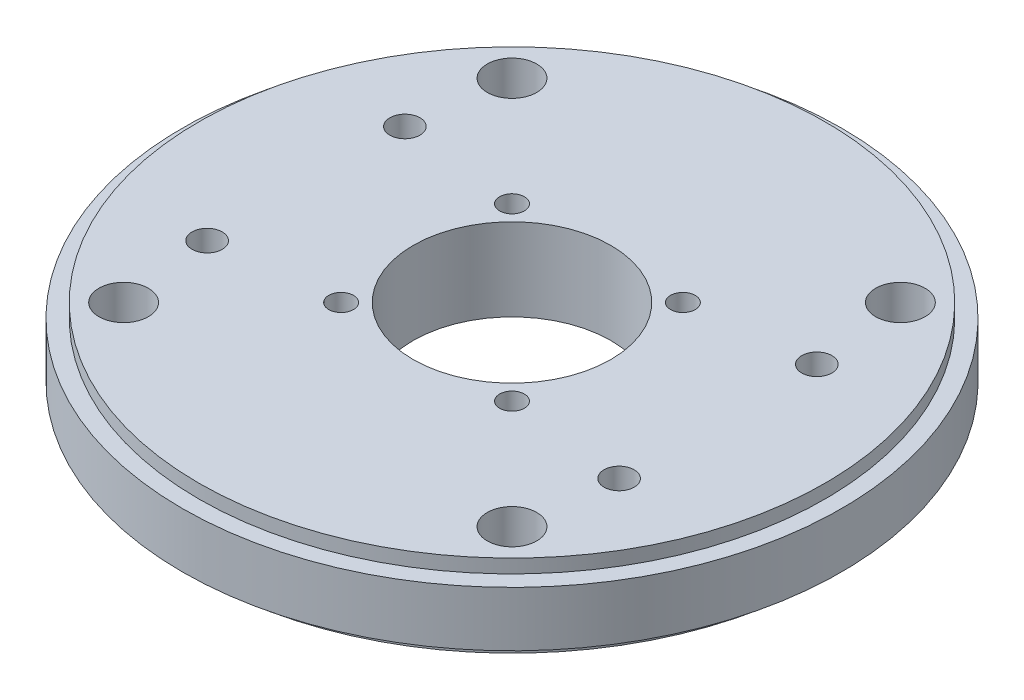
ISO-10303-21;
HEADER;
FILE_DESCRIPTION(('STEP AP214'),'2;1');
FILE_NAME('part.step','',(''),(''),'','','');
FILE_SCHEMA(('AUTOMOTIVE_DESIGN { 1 0 10303 214 1 1 1 1 }'));
ENDSEC;
DATA;
#1=APPLICATION_CONTEXT('core data for automotive mechanical design processes');
#2=APPLICATION_PROTOCOL_DEFINITION('international standard','automotive_design',2000,#1);
#3=PRODUCT_CONTEXT('',#1,'mechanical');
#4=PRODUCT('Part','Part','',(#3));
#5=PRODUCT_RELATED_PRODUCT_CATEGORY('part','',(#4));
#6=PRODUCT_DEFINITION_FORMATION('','',#4);
#7=PRODUCT_DEFINITION_CONTEXT('part definition',#1,'design');
#8=PRODUCT_DEFINITION('design','',#6,#7);
#9=PRODUCT_DEFINITION_SHAPE('','',#8);
#10=(LENGTH_UNIT() NAMED_UNIT(*) SI_UNIT(.MILLI.,.METRE.));
#11=(NAMED_UNIT(*) PLANE_ANGLE_UNIT() SI_UNIT($,.RADIAN.));
#12=(NAMED_UNIT(*) SI_UNIT($,.STERADIAN.) SOLID_ANGLE_UNIT());
#13=UNCERTAINTY_MEASURE_WITH_UNIT(LENGTH_MEASURE(1.E-05),#10,'distance_accuracy_value','');
#14=(GEOMETRIC_REPRESENTATION_CONTEXT(3) GLOBAL_UNCERTAINTY_ASSIGNED_CONTEXT((#13)) GLOBAL_UNIT_ASSIGNED_CONTEXT((#10,
#11,#12)) REPRESENTATION_CONTEXT('',''));
#15=CARTESIAN_POINT('',(0.,0.,0.));
#16=DIRECTION('',(0.,0.,1.));
#17=DIRECTION('',(1.,0.,0.));
#18=AXIS2_PLACEMENT_3D('',#15,#16,#17);
#19=CARTESIAN_POINT('',(0.,-7.5,0.));
#20=DIRECTION('',(0.,1.,0.));
#21=DIRECTION('',(0.,0.,1.));
#22=AXIS2_PLACEMENT_3D('',#19,#20,#21);
#23=PLANE('',#22);
#24=CARTESIAN_POINT('',(-35.355339059328,-7.5,-35.3553390593269));
#25=DIRECTION('',(0.,1.,0.));
#26=DIRECTION('',(0.,0.,1.));
#27=AXIS2_PLACEMENT_3D('',#24,#25,#26);
#28=CIRCLE('',#27,4.49999999999999);
#29=CARTESIAN_POINT('',(-35.355339059328,-7.5,-30.8553390593269));
#30=VERTEX_POINT('',#29);
#31=EDGE_CURVE('E131',#30,#30,#28,.T.);
#32=ORIENTED_EDGE('',*,*,#31,.T.);
#33=EDGE_LOOP('',(#32));
#34=FACE_BOUND('',#33,.T.);
#35=CARTESIAN_POINT('',(35.3553390593272,-7.5,-35.3553390593276));
#36=DIRECTION('',(0.,1.,0.));
#37=DIRECTION('',(0.,0.,1.));
#38=AXIS2_PLACEMENT_3D('',#35,#36,#37);
#39=CIRCLE('',#38,4.49999999999998);
#40=CARTESIAN_POINT('',(35.3553390593272,-7.5,-30.8553390593277));
#41=VERTEX_POINT('',#40);
#42=EDGE_CURVE('E125',#41,#41,#39,.T.);
#43=ORIENTED_EDGE('',*,*,#42,.T.);
#44=EDGE_LOOP('',(#43));
#45=FACE_BOUND('',#44,.T.);
#46=CARTESIAN_POINT('',(35.3553390593278,-7.5,35.3553390593271));
#47=DIRECTION('',(0.,1.,0.));
#48=DIRECTION('',(0.,0.,1.));
#49=AXIS2_PLACEMENT_3D('',#46,#47,#48);
#50=CIRCLE('',#49,4.49999999999998);
#51=CARTESIAN_POINT('',(35.3553390593278,-7.5,39.8553390593271));
#52=VERTEX_POINT('',#51);
#53=EDGE_CURVE('E119',#52,#52,#50,.T.);
#54=ORIENTED_EDGE('',*,*,#53,.T.);
#55=EDGE_LOOP('',(#54));
#56=FACE_BOUND('',#55,.T.);
#57=CARTESIAN_POINT('',(-35.3553390593272,-7.5,35.3553390593276));
#58=DIRECTION('',(0.,1.,0.));
#59=DIRECTION('',(0.,0.,1.));
#60=AXIS2_PLACEMENT_3D('',#57,#58,#59);
#61=CIRCLE('',#60,4.49999999999999);
#62=CARTESIAN_POINT('',(-35.3553390593272,-7.5,39.8553390593276));
#63=VERTEX_POINT('',#62);
#64=EDGE_CURVE('E113',#63,#63,#61,.T.);
#65=ORIENTED_EDGE('',*,*,#64,.T.);
#66=EDGE_LOOP('',(#65));
#67=FACE_BOUND('',#66,.T.);
#68=CARTESIAN_POINT('',(-37.5000000000002,-7.5,-18.));
#69=DIRECTION('',(0.,1.,0.));
#70=DIRECTION('',(0.,0.,1.));
#71=AXIS2_PLACEMENT_3D('',#68,#69,#70);
#72=CIRCLE('',#71,2.75);
#73=CARTESIAN_POINT('',(-37.5000000000002,-7.5,-15.25));
#74=VERTEX_POINT('',#73);
#75=EDGE_CURVE('E107',#74,#74,#72,.T.);
#76=ORIENTED_EDGE('',*,*,#75,.T.);
#77=EDGE_LOOP('',(#76));
#78=FACE_BOUND('',#77,.T.);
#79=CARTESIAN_POINT('',(-37.4999999999998,-7.5,18.));
#80=DIRECTION('',(0.,1.,0.));
#81=DIRECTION('',(0.,0.,1.));
#82=AXIS2_PLACEMENT_3D('',#79,#80,#81);
#83=CIRCLE('',#82,2.75);
#84=CARTESIAN_POINT('',(-37.4999999999998,-7.5,20.75));
#85=VERTEX_POINT('',#84);
#86=EDGE_CURVE('E101',#85,#85,#83,.T.);
#87=ORIENTED_EDGE('',*,*,#86,.T.);
#88=EDGE_LOOP('',(#87));
#89=FACE_BOUND('',#88,.T.);
#90=CARTESIAN_POINT('',(37.4999999999998,-7.5,18.));
#91=DIRECTION('',(0.,1.,0.));
#92=DIRECTION('',(0.,0.,1.));
#93=AXIS2_PLACEMENT_3D('',#90,#91,#92);
#94=CIRCLE('',#93,2.75);
#95=CARTESIAN_POINT('',(37.4999999999998,-7.5,20.75));
#96=VERTEX_POINT('',#95);
#97=EDGE_CURVE('E95',#96,#96,#94,.T.);
#98=ORIENTED_EDGE('',*,*,#97,.T.);
#99=EDGE_LOOP('',(#98));
#100=FACE_BOUND('',#99,.T.);
#101=CARTESIAN_POINT('',(37.5000000000002,-7.5,-18.));
#102=DIRECTION('',(0.,1.,0.));
#103=DIRECTION('',(0.,0.,1.));
#104=AXIS2_PLACEMENT_3D('',#101,#102,#103);
#105=CIRCLE('',#104,2.75);
#106=CARTESIAN_POINT('',(37.5000000000002,-7.5,-15.25));
#107=VERTEX_POINT('',#106);
#108=EDGE_CURVE('E89',#107,#107,#105,.T.);
#109=ORIENTED_EDGE('',*,*,#108,.T.);
#110=EDGE_LOOP('',(#109));
#111=FACE_BOUND('',#110,.T.);
#112=CARTESIAN_POINT('',(15.5563491861039,-7.5,-15.5563491861042));
#113=DIRECTION('',(0.,-1.,0.));
#114=DIRECTION('',(0.,0.,-1.));
#115=AXIS2_PLACEMENT_3D('',#112,#113,#114);
#116=CIRCLE('',#115,2.25);
#117=CARTESIAN_POINT('',(15.5563491861039,-7.5,-17.8063491861042));
#118=VERTEX_POINT('',#117);
#119=EDGE_CURVE('E86',#118,#118,#116,.T.);
#120=ORIENTED_EDGE('',*,*,#119,.F.);
#121=EDGE_LOOP('',(#120));
#122=FACE_BOUND('',#121,.T.);
#123=CARTESIAN_POINT('',(-15.556349186104,-7.5,15.5563491861041));
#124=DIRECTION('',(0.,-1.,0.));
#125=DIRECTION('',(0.,0.,-1.));
#126=AXIS2_PLACEMENT_3D('',#123,#124,#125);
#127=CIRCLE('',#126,2.25);
#128=CARTESIAN_POINT('',(-15.556349186104,-7.5,13.3063491861041));
#129=VERTEX_POINT('',#128);
#130=EDGE_CURVE('E74',#129,#129,#127,.T.);
#131=ORIENTED_EDGE('',*,*,#130,.F.);
#132=EDGE_LOOP('',(#131));
#133=FACE_BOUND('',#132,.T.);
#134=CARTESIAN_POINT('',(-15.556349186104,-7.5,-15.556349186104));
#135=DIRECTION('',(0.,-1.,0.));
#136=DIRECTION('',(0.,0.,-1.));
#137=AXIS2_PLACEMENT_3D('',#134,#135,#136);
#138=CIRCLE('',#137,2.25);
#139=CARTESIAN_POINT('',(-15.556349186104,-7.5,-17.806349186104));
#140=VERTEX_POINT('',#139);
#141=EDGE_CURVE('E68',#140,#140,#138,.T.);
#142=ORIENTED_EDGE('',*,*,#141,.F.);
#143=EDGE_LOOP('',(#142));
#144=FACE_BOUND('',#143,.T.);
#145=CARTESIAN_POINT('',(0.,-7.5,0.));
#146=DIRECTION('',(0.,1.,0.));
#147=DIRECTION('',(0.,0.,1.));
#148=AXIS2_PLACEMENT_3D('',#145,#146,#147);
#149=CIRCLE('',#148,18.);
#150=CARTESIAN_POINT('',(0.,-7.5,18.));
#151=VERTEX_POINT('',#150);
#152=EDGE_CURVE('E59',#151,#151,#149,.T.);
#153=ORIENTED_EDGE('',*,*,#152,.T.);
#154=EDGE_LOOP('',(#153));
#155=FACE_BOUND('',#154,.T.);
#156=CARTESIAN_POINT('',(0.,-7.5,0.));
#157=DIRECTION('',(0.,1.,0.));
#158=DIRECTION('',(0.,0.,1.));
#159=AXIS2_PLACEMENT_3D('',#156,#157,#158);
#160=CIRCLE('',#159,57.);
#161=CARTESIAN_POINT('',(0.,-7.5,57.));
#162=VERTEX_POINT('',#161);
#163=EDGE_CURVE('E44',#162,#162,#160,.T.);
#164=ORIENTED_EDGE('',*,*,#163,.F.);
#165=EDGE_LOOP('',(#164));
#166=FACE_BOUND('',#165,.T.);
#167=CARTESIAN_POINT('',(15.556349186104,-7.5,15.556349186104));
#168=DIRECTION('',(0.,-1.,0.));
#169=DIRECTION('',(0.,0.,-1.));
#170=AXIS2_PLACEMENT_3D('',#167,#168,#169);
#171=CIRCLE('',#170,2.25);
#172=CARTESIAN_POINT('',(15.556349186104,-7.5,13.306349186104));
#173=VERTEX_POINT('',#172);
#174=EDGE_CURVE('E80',#173,#173,#171,.T.);
#175=ORIENTED_EDGE('',*,*,#174,.F.);
#176=EDGE_LOOP('',(#175));
#177=FACE_BOUND('',#176,.T.);
#178=ADVANCED_FACE('F33',(#34,#45,#56,#67,#78,#89,#100,#111,#122,#133,#144,#155,#166,#177),#23,.F.);
#179=CARTESIAN_POINT('',(0.,7.5,0.));
#180=DIRECTION('',(0.,-1.,0.));
#181=DIRECTION('',(0.,0.,-1.));
#182=AXIS2_PLACEMENT_3D('',#179,#180,#181);
#183=CYLINDRICAL_SURFACE('',#182,57.);
#184=CARTESIAN_POINT('',(0.,5.,0.));
#185=DIRECTION('',(0.,1.,0.));
#186=DIRECTION('',(0.,0.,1.));
#187=AXIS2_PLACEMENT_3D('',#184,#185,#186);
#188=CIRCLE('',#187,57.);
#189=CARTESIAN_POINT('',(0.,5.,57.));
#190=VERTEX_POINT('',#189);
#191=EDGE_CURVE('E54',#190,#190,#188,.T.);
#192=ORIENTED_EDGE('',*,*,#191,.T.);
#193=EDGE_LOOP('',(#192));
#194=FACE_BOUND('',#193,.T.);
#195=CARTESIAN_POINT('',(0.,7.5,0.));
#196=DIRECTION('',(0.,1.,0.));
#197=DIRECTION('',(0.,0.,1.));
#198=AXIS2_PLACEMENT_3D('',#195,#196,#197);
#199=CIRCLE('',#198,57.);
#200=CARTESIAN_POINT('',(0.,7.5,57.));
#201=VERTEX_POINT('',#200);
#202=EDGE_CURVE('E40',#201,#201,#199,.T.);
#203=ORIENTED_EDGE('',*,*,#202,.F.);
#204=EDGE_LOOP('',(#203));
#205=FACE_BOUND('',#204,.T.);
#206=ADVANCED_FACE('F35',(#194,#205),#183,.T.);
#207=CARTESIAN_POINT('',(0.,7.5,0.));
#208=DIRECTION('',(0.,1.,0.));
#209=DIRECTION('',(0.,0.,1.));
#210=AXIS2_PLACEMENT_3D('',#207,#208,#209);
#211=PLANE('',#210);
#212=CARTESIAN_POINT('',(-35.355339059328,7.5,-35.3553390593269));
#213=DIRECTION('',(0.,1.,0.));
#214=DIRECTION('',(0.,0.,1.));
#215=AXIS2_PLACEMENT_3D('',#212,#213,#214);
#216=CIRCLE('',#215,4.49999999999999);
#217=CARTESIAN_POINT('',(-35.355339059328,7.5,-30.8553390593269));
#218=VERTEX_POINT('',#217);
#219=EDGE_CURVE('E134',#218,#218,#216,.T.);
#220=ORIENTED_EDGE('',*,*,#219,.F.);
#221=EDGE_LOOP('',(#220));
#222=FACE_BOUND('',#221,.T.);
#223=CARTESIAN_POINT('',(35.3553390593272,7.5,-35.3553390593276));
#224=DIRECTION('',(0.,1.,0.));
#225=DIRECTION('',(0.,0.,1.));
#226=AXIS2_PLACEMENT_3D('',#223,#224,#225);
#227=CIRCLE('',#226,4.49999999999999);
#228=CARTESIAN_POINT('',(35.3553390593272,7.5,-30.8553390593277));
#229=VERTEX_POINT('',#228);
#230=EDGE_CURVE('E128',#229,#229,#227,.T.);
#231=ORIENTED_EDGE('',*,*,#230,.F.);
#232=EDGE_LOOP('',(#231));
#233=FACE_BOUND('',#232,.T.);
#234=CARTESIAN_POINT('',(35.3553390593278,7.5,35.3553390593271));
#235=DIRECTION('',(0.,1.,0.));
#236=DIRECTION('',(0.,0.,1.));
#237=AXIS2_PLACEMENT_3D('',#234,#235,#236);
#238=CIRCLE('',#237,4.49999999999999);
#239=CARTESIAN_POINT('',(35.3553390593278,7.5,39.8553390593271));
#240=VERTEX_POINT('',#239);
#241=EDGE_CURVE('E122',#240,#240,#238,.T.);
#242=ORIENTED_EDGE('',*,*,#241,.F.);
#243=EDGE_LOOP('',(#242));
#244=FACE_BOUND('',#243,.T.);
#245=CARTESIAN_POINT('',(-35.3553390593272,7.5,35.3553390593276));
#246=DIRECTION('',(0.,1.,0.));
#247=DIRECTION('',(0.,0.,1.));
#248=AXIS2_PLACEMENT_3D('',#245,#246,#247);
#249=CIRCLE('',#248,4.49999999999999);
#250=CARTESIAN_POINT('',(-35.3553390593272,7.5,39.8553390593276));
#251=VERTEX_POINT('',#250);
#252=EDGE_CURVE('E116',#251,#251,#249,.T.);
#253=ORIENTED_EDGE('',*,*,#252,.F.);
#254=EDGE_LOOP('',(#253));
#255=FACE_BOUND('',#254,.T.);
#256=CARTESIAN_POINT('',(-37.5000000000002,7.5,-18.));
#257=DIRECTION('',(0.,1.,0.));
#258=DIRECTION('',(0.,0.,1.));
#259=AXIS2_PLACEMENT_3D('',#256,#257,#258);
#260=CIRCLE('',#259,2.74999999999999);
#261=CARTESIAN_POINT('',(-37.5000000000002,7.5,-15.25));
#262=VERTEX_POINT('',#261);
#263=EDGE_CURVE('E110',#262,#262,#260,.T.);
#264=ORIENTED_EDGE('',*,*,#263,.F.);
#265=EDGE_LOOP('',(#264));
#266=FACE_BOUND('',#265,.T.);
#267=CARTESIAN_POINT('',(-37.4999999999998,7.5,18.));
#268=DIRECTION('',(0.,1.,0.));
#269=DIRECTION('',(0.,0.,1.));
#270=AXIS2_PLACEMENT_3D('',#267,#268,#269);
#271=CIRCLE('',#270,2.74999999999999);
#272=CARTESIAN_POINT('',(-37.4999999999998,7.5,20.75));
#273=VERTEX_POINT('',#272);
#274=EDGE_CURVE('E104',#273,#273,#271,.T.);
#275=ORIENTED_EDGE('',*,*,#274,.F.);
#276=EDGE_LOOP('',(#275));
#277=FACE_BOUND('',#276,.T.);
#278=CARTESIAN_POINT('',(37.4999999999998,7.5,18.));
#279=DIRECTION('',(0.,1.,0.));
#280=DIRECTION('',(0.,0.,1.));
#281=AXIS2_PLACEMENT_3D('',#278,#279,#280);
#282=CIRCLE('',#281,2.74999999999999);
#283=CARTESIAN_POINT('',(37.4999999999998,7.5,20.75));
#284=VERTEX_POINT('',#283);
#285=EDGE_CURVE('E98',#284,#284,#282,.T.);
#286=ORIENTED_EDGE('',*,*,#285,.F.);
#287=EDGE_LOOP('',(#286));
#288=FACE_BOUND('',#287,.T.);
#289=CARTESIAN_POINT('',(37.5000000000002,7.5,-18.));
#290=DIRECTION('',(0.,1.,0.));
#291=DIRECTION('',(0.,0.,1.));
#292=AXIS2_PLACEMENT_3D('',#289,#290,#291);
#293=CIRCLE('',#292,2.74999999999999);
#294=CARTESIAN_POINT('',(37.5000000000002,7.5,-15.25));
#295=VERTEX_POINT('',#294);
#296=EDGE_CURVE('E92',#295,#295,#293,.T.);
#297=ORIENTED_EDGE('',*,*,#296,.F.);
#298=EDGE_LOOP('',(#297));
#299=FACE_BOUND('',#298,.T.);
#300=CARTESIAN_POINT('',(15.5563491861039,7.5,-15.5563491861042));
#301=DIRECTION('',(0.,-1.,0.));
#302=DIRECTION('',(0.,0.,-1.));
#303=AXIS2_PLACEMENT_3D('',#300,#301,#302);
#304=CIRCLE('',#303,2.25);
#305=CARTESIAN_POINT('',(15.5563491861039,7.5,-17.8063491861042));
#306=VERTEX_POINT('',#305);
#307=EDGE_CURVE('E83',#306,#306,#304,.T.);
#308=ORIENTED_EDGE('',*,*,#307,.T.);
#309=EDGE_LOOP('',(#308));
#310=FACE_BOUND('',#309,.T.);
#311=CARTESIAN_POINT('',(15.556349186104,7.5,15.556349186104));
#312=DIRECTION('',(0.,-1.,0.));
#313=DIRECTION('',(0.,0.,-1.));
#314=AXIS2_PLACEMENT_3D('',#311,#312,#313);
#315=CIRCLE('',#314,2.25);
#316=CARTESIAN_POINT('',(15.556349186104,7.5,13.306349186104));
#317=VERTEX_POINT('',#316);
#318=EDGE_CURVE('E77',#317,#317,#315,.T.);
#319=ORIENTED_EDGE('',*,*,#318,.T.);
#320=EDGE_LOOP('',(#319));
#321=FACE_BOUND('',#320,.T.);
#322=CARTESIAN_POINT('',(-15.556349186104,7.5,15.5563491861041));
#323=DIRECTION('',(0.,-1.,0.));
#324=DIRECTION('',(0.,0.,-1.));
#325=AXIS2_PLACEMENT_3D('',#322,#323,#324);
#326=CIRCLE('',#325,2.25);
#327=CARTESIAN_POINT('',(-15.556349186104,7.5,13.3063491861041));
#328=VERTEX_POINT('',#327);
#329=EDGE_CURVE('E71',#328,#328,#326,.T.);
#330=ORIENTED_EDGE('',*,*,#329,.T.);
#331=EDGE_LOOP('',(#330));
#332=FACE_BOUND('',#331,.T.);
#333=CARTESIAN_POINT('',(-15.556349186104,7.5,-15.556349186104));
#334=DIRECTION('',(0.,-1.,0.));
#335=DIRECTION('',(0.,0.,-1.));
#336=AXIS2_PLACEMENT_3D('',#333,#334,#335);
#337=CIRCLE('',#336,2.25);
#338=CARTESIAN_POINT('',(-15.556349186104,7.5,-17.806349186104));
#339=VERTEX_POINT('',#338);
#340=EDGE_CURVE('E65',#339,#339,#337,.T.);
#341=ORIENTED_EDGE('',*,*,#340,.T.);
#342=EDGE_LOOP('',(#341));
#343=FACE_BOUND('',#342,.T.);
#344=CARTESIAN_POINT('',(0.,7.5,0.));
#345=DIRECTION('',(0.,1.,0.));
#346=DIRECTION('',(0.,0.,1.));
#347=AXIS2_PLACEMENT_3D('',#344,#345,#346);
#348=CIRCLE('',#347,18.);
#349=CARTESIAN_POINT('',(0.,7.5,18.));
#350=VERTEX_POINT('',#349);
#351=EDGE_CURVE('E62',#350,#350,#348,.T.);
#352=ORIENTED_EDGE('',*,*,#351,.F.);
#353=EDGE_LOOP('',(#352));
#354=FACE_BOUND('',#353,.T.);
#355=ORIENTED_EDGE('',*,*,#202,.T.);
#356=EDGE_LOOP('',(#355));
#357=FACE_BOUND('',#356,.T.);
#358=ADVANCED_FACE('F140',(#222,#233,#244,#255,#266,#277,#288,#299,#310,#321,#332,#343,#354,
#357),#211,.T.);
#359=CARTESIAN_POINT('',(0.,5.,0.));
#360=DIRECTION('',(0.,1.,0.));
#361=DIRECTION('',(0.,0.,1.));
#362=AXIS2_PLACEMENT_3D('',#359,#360,#361);
#363=PLANE('',#362);
#364=CARTESIAN_POINT('',(0.,5.,0.));
#365=DIRECTION('',(0.,1.,0.));
#366=DIRECTION('',(0.,0.,1.));
#367=AXIS2_PLACEMENT_3D('',#364,#365,#366);
#368=CIRCLE('',#367,60.);
#369=CARTESIAN_POINT('',(0.,5.,60.));
#370=VERTEX_POINT('',#369);
#371=EDGE_CURVE('E49',#370,#370,#368,.T.);
#372=ORIENTED_EDGE('',*,*,#371,.T.);
#373=EDGE_LOOP('',(#372));
#374=FACE_BOUND('',#373,.T.);
#375=ORIENTED_EDGE('',*,*,#191,.F.);
#376=EDGE_LOOP('',(#375));
#377=FACE_BOUND('',#376,.T.);
#378=ADVANCED_FACE('F143',(#374,#377),#363,.T.);
#379=CARTESIAN_POINT('',(0.,-5.,0.));
#380=DIRECTION('',(0.,1.,0.));
#381=DIRECTION('',(0.,0.,1.));
#382=AXIS2_PLACEMENT_3D('',#379,#380,#381);
#383=PLANE('',#382);
#384=CARTESIAN_POINT('',(0.,-5.,0.));
#385=DIRECTION('',(0.,1.,0.));
#386=DIRECTION('',(0.,0.,1.));
#387=AXIS2_PLACEMENT_3D('',#384,#385,#386);
#388=CIRCLE('',#387,60.);
#389=CARTESIAN_POINT('',(0.,-5.,60.));
#390=VERTEX_POINT('',#389);
#391=EDGE_CURVE('E51',#390,#390,#388,.T.);
#392=ORIENTED_EDGE('',*,*,#391,.F.);
#393=EDGE_LOOP('',(#392));
#394=FACE_BOUND('',#393,.T.);
#395=CARTESIAN_POINT('',(0.,-5.,0.));
#396=DIRECTION('',(0.,1.,0.));
#397=DIRECTION('',(0.,0.,1.));
#398=AXIS2_PLACEMENT_3D('',#395,#396,#397);
#399=CIRCLE('',#398,57.);
#400=CARTESIAN_POINT('',(0.,-5.,57.));
#401=VERTEX_POINT('',#400);
#402=EDGE_CURVE('E10',#401,#401,#399,.T.);
#403=ORIENTED_EDGE('',*,*,#402,.T.);
#404=EDGE_LOOP('',(#403));
#405=FACE_BOUND('',#404,.T.);
#406=ADVANCED_FACE('F196',(#394,#405),#383,.F.);
#407=CARTESIAN_POINT('',(0.,5.,0.));
#408=DIRECTION('',(0.,-1.,0.));
#409=DIRECTION('',(0.,0.,-1.));
#410=AXIS2_PLACEMENT_3D('',#407,#408,#409);
#411=CYLINDRICAL_SURFACE('',#410,60.);
#412=ORIENTED_EDGE('',*,*,#371,.F.);
#413=EDGE_LOOP('',(#412));
#414=FACE_BOUND('',#413,.T.);
#415=ORIENTED_EDGE('',*,*,#391,.T.);
#416=EDGE_LOOP('',(#415));
#417=FACE_BOUND('',#416,.T.);
#418=ADVANCED_FACE('F182',(#414,#417),#411,.T.);
#419=ORIENTED_EDGE('',*,*,#163,.T.);
#420=EDGE_LOOP('',(#419));
#421=FACE_BOUND('',#420,.T.);
#422=ORIENTED_EDGE('',*,*,#402,.F.);
#423=EDGE_LOOP('',(#422));
#424=FACE_BOUND('',#423,.T.);
#425=ADVANCED_FACE('F172',(#421,#424),#183,.T.);
#426=CARTESIAN_POINT('',(0.,-7.5,0.));
#427=DIRECTION('',(0.,1.,0.));
#428=DIRECTION('',(0.,0.,1.));
#429=AXIS2_PLACEMENT_3D('',#426,#427,#428);
#430=CYLINDRICAL_SURFACE('',#429,18.);
#431=ORIENTED_EDGE('',*,*,#152,.F.);
#432=EDGE_LOOP('',(#431));
#433=FACE_BOUND('',#432,.T.);
#434=ORIENTED_EDGE('',*,*,#351,.T.);
#435=EDGE_LOOP('',(#434));
#436=FACE_BOUND('',#435,.T.);
#437=ADVANCED_FACE('F169',(#433,#436),#430,.F.);
#438=CARTESIAN_POINT('',(-15.556349186104,-7.5,-15.556349186104));
#439=DIRECTION('',(0.,-1.,0.));
#440=DIRECTION('',(0.,0.,-1.));
#441=AXIS2_PLACEMENT_3D('',#438,#439,#440);
#442=CYLINDRICAL_SURFACE('',#441,2.25);
#443=ORIENTED_EDGE('',*,*,#340,.F.);
#444=EDGE_LOOP('',(#443));
#445=FACE_BOUND('',#444,.T.);
#446=ORIENTED_EDGE('',*,*,#141,.T.);
#447=EDGE_LOOP('',(#446));
#448=FACE_BOUND('',#447,.T.);
#449=ADVANCED_FACE('F171',(#445,#448),#442,.F.);
#450=CARTESIAN_POINT('',(-15.556349186104,-7.5,15.5563491861041));
#451=DIRECTION('',(0.,-1.,0.));
#452=DIRECTION('',(0.,0.,-1.));
#453=AXIS2_PLACEMENT_3D('',#450,#451,#452);
#454=CYLINDRICAL_SURFACE('',#453,2.25);
#455=ORIENTED_EDGE('',*,*,#329,.F.);
#456=EDGE_LOOP('',(#455));
#457=FACE_BOUND('',#456,.T.);
#458=ORIENTED_EDGE('',*,*,#130,.T.);
#459=EDGE_LOOP('',(#458));
#460=FACE_BOUND('',#459,.T.);
#461=ADVANCED_FACE('F179',(#457,#460),#454,.F.);
#462=CARTESIAN_POINT('',(15.556349186104,-7.5,15.556349186104));
#463=DIRECTION('',(0.,-1.,0.));
#464=DIRECTION('',(0.,0.,-1.));
#465=AXIS2_PLACEMENT_3D('',#462,#463,#464);
#466=CYLINDRICAL_SURFACE('',#465,2.25);
#467=ORIENTED_EDGE('',*,*,#318,.F.);
#468=EDGE_LOOP('',(#467));
#469=FACE_BOUND('',#468,.T.);
#470=ORIENTED_EDGE('',*,*,#174,.T.);
#471=EDGE_LOOP('',(#470));
#472=FACE_BOUND('',#471,.T.);
#473=ADVANCED_FACE('F246',(#469,#472),#466,.F.);
#474=CARTESIAN_POINT('',(15.5563491861039,-7.5,-15.5563491861042));
#475=DIRECTION('',(0.,-1.,0.));
#476=DIRECTION('',(0.,0.,-1.));
#477=AXIS2_PLACEMENT_3D('',#474,#475,#476);
#478=CYLINDRICAL_SURFACE('',#477,2.25);
#479=ORIENTED_EDGE('',*,*,#307,.F.);
#480=EDGE_LOOP('',(#479));
#481=FACE_BOUND('',#480,.T.);
#482=ORIENTED_EDGE('',*,*,#119,.T.);
#483=EDGE_LOOP('',(#482));
#484=FACE_BOUND('',#483,.T.);
#485=ADVANCED_FACE('F256',(#481,#484),#478,.F.);
#486=CARTESIAN_POINT('',(37.5000000000002,7.5,-18.));
#487=DIRECTION('',(0.,1.,0.));
#488=DIRECTION('',(0.,0.,1.));
#489=AXIS2_PLACEMENT_3D('',#486,#487,#488);
#490=CYLINDRICAL_SURFACE('',#489,2.74999999999999);
#491=ORIENTED_EDGE('',*,*,#108,.F.);
#492=EDGE_LOOP('',(#491));
#493=FACE_BOUND('',#492,.T.);
#494=ORIENTED_EDGE('',*,*,#296,.T.);
#495=EDGE_LOOP('',(#494));
#496=FACE_BOUND('',#495,.T.);
#497=ADVANCED_FACE('F266',(#493,#496),#490,.F.);
#498=CARTESIAN_POINT('',(37.4999999999998,7.5,18.));
#499=DIRECTION('',(0.,1.,0.));
#500=DIRECTION('',(0.,0.,1.));
#501=AXIS2_PLACEMENT_3D('',#498,#499,#500);
#502=CYLINDRICAL_SURFACE('',#501,2.74999999999999);
#503=ORIENTED_EDGE('',*,*,#97,.F.);
#504=EDGE_LOOP('',(#503));
#505=FACE_BOUND('',#504,.T.);
#506=ORIENTED_EDGE('',*,*,#285,.T.);
#507=EDGE_LOOP('',(#506));
#508=FACE_BOUND('',#507,.T.);
#509=ADVANCED_FACE('F276',(#505,#508),#502,.F.);
#510=CARTESIAN_POINT('',(-37.4999999999998,7.5,18.));
#511=DIRECTION('',(0.,1.,0.));
#512=DIRECTION('',(0.,0.,1.));
#513=AXIS2_PLACEMENT_3D('',#510,#511,#512);
#514=CYLINDRICAL_SURFACE('',#513,2.74999999999999);
#515=ORIENTED_EDGE('',*,*,#86,.F.);
#516=EDGE_LOOP('',(#515));
#517=FACE_BOUND('',#516,.T.);
#518=ORIENTED_EDGE('',*,*,#274,.T.);
#519=EDGE_LOOP('',(#518));
#520=FACE_BOUND('',#519,.T.);
#521=ADVANCED_FACE('F286',(#517,#520),#514,.F.);
#522=CARTESIAN_POINT('',(-37.5000000000002,7.5,-18.));
#523=DIRECTION('',(0.,1.,0.));
#524=DIRECTION('',(0.,0.,1.));
#525=AXIS2_PLACEMENT_3D('',#522,#523,#524);
#526=CYLINDRICAL_SURFACE('',#525,2.74999999999999);
#527=ORIENTED_EDGE('',*,*,#75,.F.);
#528=EDGE_LOOP('',(#527));
#529=FACE_BOUND('',#528,.T.);
#530=ORIENTED_EDGE('',*,*,#263,.T.);
#531=EDGE_LOOP('',(#530));
#532=FACE_BOUND('',#531,.T.);
#533=ADVANCED_FACE('F296',(#529,#532),#526,.F.);
#534=CARTESIAN_POINT('',(-35.3553390593272,7.5,35.3553390593276));
#535=DIRECTION('',(0.,1.,0.));
#536=DIRECTION('',(0.,0.,1.));
#537=AXIS2_PLACEMENT_3D('',#534,#535,#536);
#538=CYLINDRICAL_SURFACE('',#537,4.49999999999999);
#539=ORIENTED_EDGE('',*,*,#64,.F.);
#540=EDGE_LOOP('',(#539));
#541=FACE_BOUND('',#540,.T.);
#542=ORIENTED_EDGE('',*,*,#252,.T.);
#543=EDGE_LOOP('',(#542));
#544=FACE_BOUND('',#543,.T.);
#545=ADVANCED_FACE('F306',(#541,#544),#538,.F.);
#546=CARTESIAN_POINT('',(35.3553390593278,7.5,35.3553390593271));
#547=DIRECTION('',(0.,1.,0.));
#548=DIRECTION('',(0.,0.,1.));
#549=AXIS2_PLACEMENT_3D('',#546,#547,#548);
#550=CYLINDRICAL_SURFACE('',#549,4.49999999999999);
#551=ORIENTED_EDGE('',*,*,#53,.F.);
#552=EDGE_LOOP('',(#551));
#553=FACE_BOUND('',#552,.T.);
#554=ORIENTED_EDGE('',*,*,#241,.T.);
#555=EDGE_LOOP('',(#554));
#556=FACE_BOUND('',#555,.T.);
#557=ADVANCED_FACE('F315',(#553,#556),#550,.F.);
#558=CARTESIAN_POINT('',(35.3553390593272,7.5,-35.3553390593276));
#559=DIRECTION('',(0.,1.,0.));
#560=DIRECTION('',(0.,0.,1.));
#561=AXIS2_PLACEMENT_3D('',#558,#559,#560);
#562=CYLINDRICAL_SURFACE('',#561,4.49999999999999);
#563=ORIENTED_EDGE('',*,*,#42,.F.);
#564=EDGE_LOOP('',(#563));
#565=FACE_BOUND('',#564,.T.);
#566=ORIENTED_EDGE('',*,*,#230,.T.);
#567=EDGE_LOOP('',(#566));
#568=FACE_BOUND('',#567,.T.);
#569=ADVANCED_FACE('F333',(#565,#568),#562,.F.);
#570=CARTESIAN_POINT('',(-35.355339059328,7.5,-35.3553390593269));
#571=DIRECTION('',(0.,1.,0.));
#572=DIRECTION('',(0.,0.,1.));
#573=AXIS2_PLACEMENT_3D('',#570,#571,#572);
#574=CYLINDRICAL_SURFACE('',#573,4.49999999999999);
#575=ORIENTED_EDGE('',*,*,#31,.F.);
#576=EDGE_LOOP('',(#575));
#577=FACE_BOUND('',#576,.T.);
#578=ORIENTED_EDGE('',*,*,#219,.T.);
#579=EDGE_LOOP('',(#578));
#580=FACE_BOUND('',#579,.T.);
#581=ADVANCED_FACE('F138',(#577,#580),#574,.F.);
#582=CLOSED_SHELL('',(#178,#206,#358,#378,#406,#418,#425,#437,#449,#461,#473,#485,#497,#509,
#521,#533,#545,#557,#569,#581));
#583=MANIFOLD_SOLID_BREP('B2',#582);
#584=ADVANCED_BREP_SHAPE_REPRESENTATION('',(#18,#583),#14);
#585=SHAPE_DEFINITION_REPRESENTATION(#9,#584);
ENDSEC;
END-ISO-10303-21;
